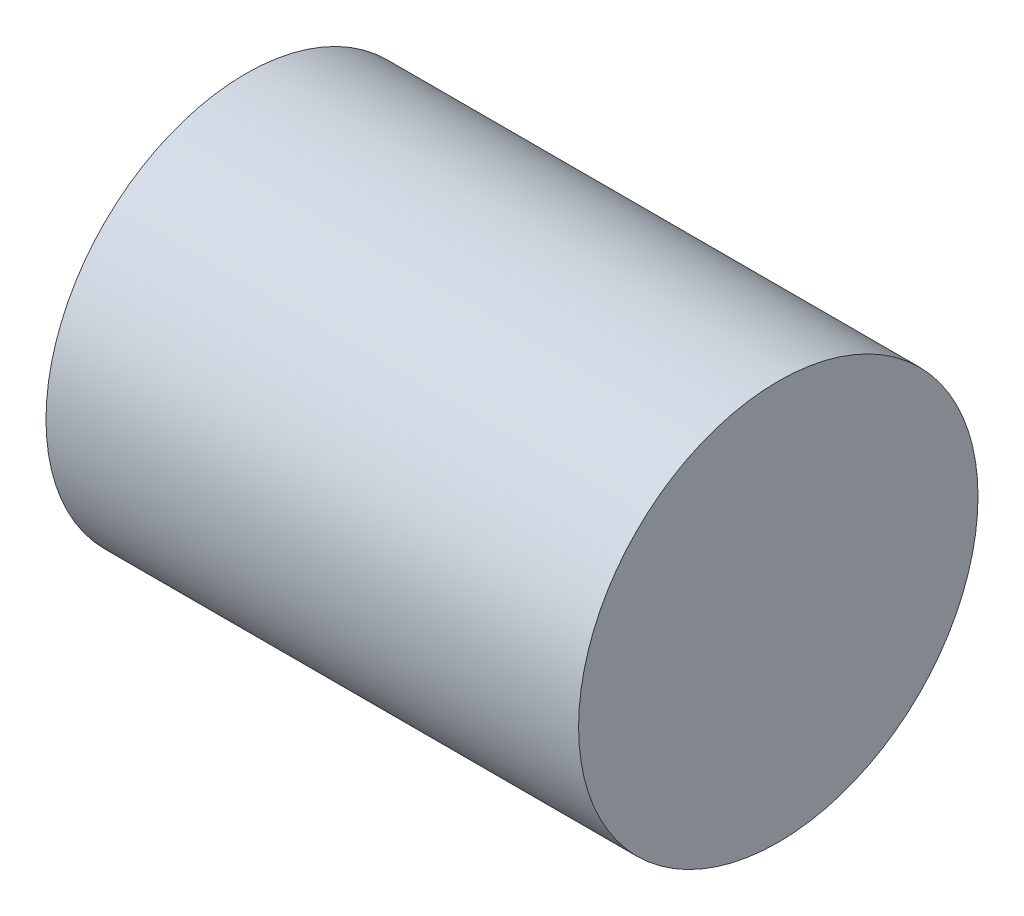
ISO-10303-21;
HEADER;
FILE_DESCRIPTION(('STEP AP214'),'2;1');
FILE_NAME('part.step','',(''),(''),'','','');
FILE_SCHEMA(('AUTOMOTIVE_DESIGN { 1 0 10303 214 1 1 1 1 }'));
ENDSEC;
DATA;
#1=APPLICATION_CONTEXT('core data for automotive mechanical design processes');
#2=APPLICATION_PROTOCOL_DEFINITION('international standard','automotive_design',2000,#1);
#3=PRODUCT_CONTEXT('',#1,'mechanical');
#4=PRODUCT('Part','Part','',(#3));
#5=PRODUCT_RELATED_PRODUCT_CATEGORY('part','',(#4));
#6=PRODUCT_DEFINITION_FORMATION('','',#4);
#7=PRODUCT_DEFINITION_CONTEXT('part definition',#1,'design');
#8=PRODUCT_DEFINITION('design','',#6,#7);
#9=PRODUCT_DEFINITION_SHAPE('','',#8);
#10=(LENGTH_UNIT() NAMED_UNIT(*) SI_UNIT(.MILLI.,.METRE.));
#11=(NAMED_UNIT(*) PLANE_ANGLE_UNIT() SI_UNIT($,.RADIAN.));
#12=(NAMED_UNIT(*) SI_UNIT($,.STERADIAN.) SOLID_ANGLE_UNIT());
#13=UNCERTAINTY_MEASURE_WITH_UNIT(LENGTH_MEASURE(1.E-05),#10,'distance_accuracy_value','');
#14=(GEOMETRIC_REPRESENTATION_CONTEXT(3) GLOBAL_UNCERTAINTY_ASSIGNED_CONTEXT((#13)) GLOBAL_UNIT_ASSIGNED_CONTEXT((#10,
#11,#12)) REPRESENTATION_CONTEXT('',''));
#15=CARTESIAN_POINT('',(0.,0.,0.));
#16=DIRECTION('',(0.,0.,1.));
#17=DIRECTION('',(1.,0.,0.));
#18=AXIS2_PLACEMENT_3D('',#15,#16,#17);
#19=CARTESIAN_POINT('',(-12.,0.,0.));
#20=DIRECTION('',(1.,0.,0.));
#21=DIRECTION('',(0.,0.,-1.));
#22=AXIS2_PLACEMENT_3D('',#19,#20,#21);
#23=CYLINDRICAL_SURFACE('',#22,4.5);
#24=CARTESIAN_POINT('',(-12.,0.,0.));
#25=DIRECTION('',(1.,0.,0.));
#26=DIRECTION('',(0.,0.,-1.));
#27=AXIS2_PLACEMENT_3D('',#24,#25,#26);
#28=CIRCLE('',#27,4.5);
#29=CARTESIAN_POINT('',(-12.,0.,-4.5));
#30=VERTEX_POINT('',#29);
#31=EDGE_CURVE('E10',#30,#30,#28,.T.);
#32=ORIENTED_EDGE('',*,*,#31,.T.);
#33=EDGE_LOOP('',(#32));
#34=FACE_BOUND('',#33,.T.);
#35=CARTESIAN_POINT('',(0.,0.,0.));
#36=DIRECTION('',(1.,0.,0.));
#37=DIRECTION('',(0.,0.,-1.));
#38=AXIS2_PLACEMENT_3D('',#35,#36,#37);
#39=CIRCLE('',#38,4.5);
#40=CARTESIAN_POINT('',(0.,0.,-4.5));
#41=VERTEX_POINT('',#40);
#42=EDGE_CURVE('E36',#41,#41,#39,.T.);
#43=ORIENTED_EDGE('',*,*,#42,.F.);
#44=EDGE_LOOP('',(#43));
#45=FACE_BOUND('',#44,.T.);
#46=ADVANCED_FACE('F33',(#34,#45),#23,.T.);
#47=CARTESIAN_POINT('',(-12.,0.,0.));
#48=DIRECTION('',(1.,0.,0.));
#49=DIRECTION('',(0.,0.,-1.));
#50=AXIS2_PLACEMENT_3D('',#47,#48,#49);
#51=PLANE('',#50);
#52=ORIENTED_EDGE('',*,*,#31,.F.);
#53=EDGE_LOOP('',(#52));
#54=FACE_BOUND('',#53,.T.);
#55=ADVANCED_FACE('F48',(#54),#51,.F.);
#56=CARTESIAN_POINT('',(0.,0.,0.));
#57=DIRECTION('',(1.,0.,0.));
#58=DIRECTION('',(0.,0.,-1.));
#59=AXIS2_PLACEMENT_3D('',#56,#57,#58);
#60=PLANE('',#59);
#61=ORIENTED_EDGE('',*,*,#42,.T.);
#62=EDGE_LOOP('',(#61));
#63=FACE_BOUND('',#62,.T.);
#64=ADVANCED_FACE('F45',(#63),#60,.T.);
#65=CLOSED_SHELL('',(#46,#55,#64));
#66=MANIFOLD_SOLID_BREP('B2',#65);
#67=ADVANCED_BREP_SHAPE_REPRESENTATION('',(#18,#66),#14);
#68=SHAPE_DEFINITION_REPRESENTATION(#9,#67);
ENDSEC;
END-ISO-10303-21;
